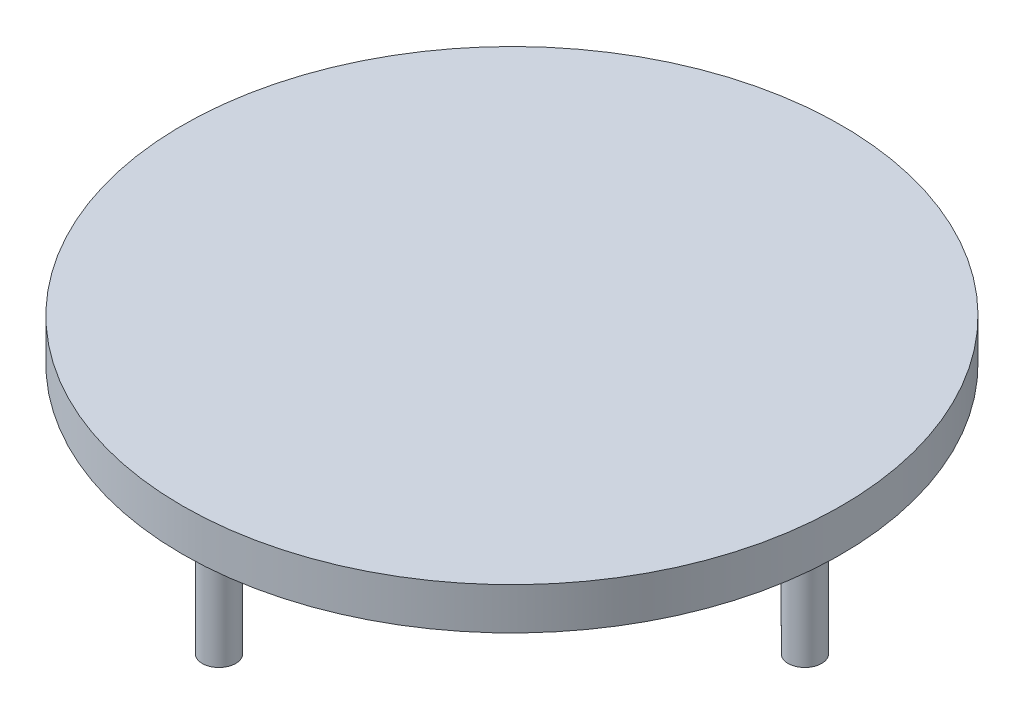
ISO-10303-21;
HEADER;
FILE_DESCRIPTION(('STEP AP214'),'2;1');
FILE_NAME('part.step','',(''),(''),'','','');
FILE_SCHEMA(('AUTOMOTIVE_DESIGN { 1 0 10303 214 1 1 1 1 }'));
ENDSEC;
DATA;
#1=APPLICATION_CONTEXT('core data for automotive mechanical design processes');
#2=APPLICATION_PROTOCOL_DEFINITION('international standard','automotive_design',2000,#1);
#3=PRODUCT_CONTEXT('',#1,'mechanical');
#4=PRODUCT('Part','Part','',(#3));
#5=PRODUCT_RELATED_PRODUCT_CATEGORY('part','',(#4));
#6=PRODUCT_DEFINITION_FORMATION('','',#4);
#7=PRODUCT_DEFINITION_CONTEXT('part definition',#1,'design');
#8=PRODUCT_DEFINITION('design','',#6,#7);
#9=PRODUCT_DEFINITION_SHAPE('','',#8);
#10=(LENGTH_UNIT() NAMED_UNIT(*) SI_UNIT(.MILLI.,.METRE.));
#11=(NAMED_UNIT(*) PLANE_ANGLE_UNIT() SI_UNIT($,.RADIAN.));
#12=(NAMED_UNIT(*) SI_UNIT($,.STERADIAN.) SOLID_ANGLE_UNIT());
#13=UNCERTAINTY_MEASURE_WITH_UNIT(LENGTH_MEASURE(1.E-05),#10,'distance_accuracy_value','');
#14=(GEOMETRIC_REPRESENTATION_CONTEXT(3) GLOBAL_UNCERTAINTY_ASSIGNED_CONTEXT((#13)) GLOBAL_UNIT_ASSIGNED_CONTEXT((#10,
#11,#12)) REPRESENTATION_CONTEXT('',''));
#15=CARTESIAN_POINT('',(0.,0.,0.));
#16=DIRECTION('',(0.,0.,1.));
#17=DIRECTION('',(1.,0.,0.));
#18=AXIS2_PLACEMENT_3D('',#15,#16,#17);
#19=CARTESIAN_POINT('',(0.,2.,0.));
#20=DIRECTION('',(0.,-1.,0.));
#21=DIRECTION('',(0.,0.,-1.));
#22=AXIS2_PLACEMENT_3D('',#19,#20,#21);
#23=CYLINDRICAL_SURFACE('',#22,15.75);
#24=CARTESIAN_POINT('',(0.,2.,0.));
#25=DIRECTION('',(0.,1.,0.));
#26=DIRECTION('',(0.,0.,1.));
#27=AXIS2_PLACEMENT_3D('',#24,#25,#26);
#28=CIRCLE('',#27,15.75);
#29=CARTESIAN_POINT('',(0.,2.,15.75));
#30=VERTEX_POINT('',#29);
#31=EDGE_CURVE('E64',#30,#30,#28,.T.);
#32=ORIENTED_EDGE('',*,*,#31,.F.);
#33=EDGE_LOOP('',(#32));
#34=FACE_BOUND('',#33,.T.);
#35=CARTESIAN_POINT('',(0.,0.,0.));
#36=DIRECTION('',(0.,1.,0.));
#37=DIRECTION('',(0.,0.,1.));
#38=AXIS2_PLACEMENT_3D('',#35,#36,#37);
#39=CIRCLE('',#38,15.75);
#40=CARTESIAN_POINT('',(0.,0.,15.75));
#41=VERTEX_POINT('',#40);
#42=EDGE_CURVE('E65',#41,#41,#39,.T.);
#43=ORIENTED_EDGE('',*,*,#42,.T.);
#44=EDGE_LOOP('',(#43));
#45=FACE_BOUND('',#44,.T.);
#46=ADVANCED_FACE('F41',(#34,#45),#23,.T.);
#47=CARTESIAN_POINT('',(0.,2.,0.));
#48=DIRECTION('',(0.,1.,0.));
#49=DIRECTION('',(0.,0.,1.));
#50=AXIS2_PLACEMENT_3D('',#47,#48,#49);
#51=PLANE('',#50);
#52=ORIENTED_EDGE('',*,*,#31,.T.);
#53=EDGE_LOOP('',(#52));
#54=FACE_BOUND('',#53,.T.);
#55=ADVANCED_FACE('F104',(#54),#51,.T.);
#56=CARTESIAN_POINT('',(0.,0.,0.));
#57=DIRECTION('',(0.,1.,0.));
#58=DIRECTION('',(0.,0.,1.));
#59=AXIS2_PLACEMENT_3D('',#56,#57,#58);
#60=PLANE('',#59);
#61=CARTESIAN_POINT('',(-13.9999999999996,0.,-3.97046679266253E-13));
#62=DIRECTION('',(0.,1.,0.));
#63=DIRECTION('',(0.,0.,1.));
#64=AXIS2_PLACEMENT_3D('',#61,#62,#63);
#65=CIRCLE('',#64,0.800000000000636);
#66=CARTESIAN_POINT('',(-13.9999999999996,0.,0.800000000000238));
#67=VERTEX_POINT('',#66);
#68=EDGE_CURVE('E10',#67,#67,#65,.F.);
#69=ORIENTED_EDGE('',*,*,#68,.F.);
#70=EDGE_LOOP('',(#69));
#71=FACE_BOUND('',#70,.T.);
#72=CARTESIAN_POINT('',(7.90664347494893E-13,0.,-14.));
#73=DIRECTION('',(0.,1.,0.));
#74=DIRECTION('',(0.,0.,1.));
#75=AXIS2_PLACEMENT_3D('',#72,#73,#74);
#76=CIRCLE('',#75,0.80000000000085);
#77=CARTESIAN_POINT('',(7.90664347494893E-13,0.,-13.1999999999992));
#78=VERTEX_POINT('',#77);
#79=EDGE_CURVE('E48',#78,#78,#76,.F.);
#80=ORIENTED_EDGE('',*,*,#79,.F.);
#81=EDGE_LOOP('',(#80));
#82=FACE_BOUND('',#81,.T.);
#83=CARTESIAN_POINT('',(14.0000000000004,0.,3.95332173747447E-13));
#84=DIRECTION('',(0.,1.,0.));
#85=DIRECTION('',(0.,0.,1.));
#86=AXIS2_PLACEMENT_3D('',#83,#84,#85);
#87=CIRCLE('',#86,0.800000000000309);
#88=CARTESIAN_POINT('',(14.0000000000004,0.,0.800000000000704));
#89=VERTEX_POINT('',#88);
#90=EDGE_CURVE('E53',#89,#89,#87,.F.);
#91=ORIENTED_EDGE('',*,*,#90,.F.);
#92=EDGE_LOOP('',(#91));
#93=FACE_BOUND('',#92,.T.);
#94=CARTESIAN_POINT('',(0.,0.,14.));
#95=DIRECTION('',(0.,1.,0.));
#96=DIRECTION('',(0.,0.,1.));
#97=AXIS2_PLACEMENT_3D('',#94,#95,#96);
#98=CIRCLE('',#97,0.8);
#99=CARTESIAN_POINT('',(0.,0.,14.8));
#100=VERTEX_POINT('',#99);
#101=EDGE_CURVE('E58',#100,#100,#98,.F.);
#102=ORIENTED_EDGE('',*,*,#101,.F.);
#103=EDGE_LOOP('',(#102));
#104=FACE_BOUND('',#103,.T.);
#105=ORIENTED_EDGE('',*,*,#42,.F.);
#106=EDGE_LOOP('',(#105));
#107=FACE_BOUND('',#106,.T.);
#108=ADVANCED_FACE('F109',(#71,#82,#93,#104,#107),#60,.F.);
#109=CARTESIAN_POINT('',(0.,-5.,14.));
#110=DIRECTION('',(0.,1.,0.));
#111=DIRECTION('',(0.,0.,1.));
#112=AXIS2_PLACEMENT_3D('',#109,#110,#111);
#113=CYLINDRICAL_SURFACE('',#112,0.8);
#114=CARTESIAN_POINT('',(0.,-5.,14.));
#115=DIRECTION('',(0.,-1.,0.));
#116=DIRECTION('',(0.,0.,-1.));
#117=AXIS2_PLACEMENT_3D('',#114,#115,#116);
#118=CIRCLE('',#117,0.8);
#119=CARTESIAN_POINT('',(0.,-5.,13.2));
#120=VERTEX_POINT('',#119);
#121=EDGE_CURVE('E69',#120,#120,#118,.T.);
#122=ORIENTED_EDGE('',*,*,#121,.F.);
#123=EDGE_LOOP('',(#122));
#124=FACE_BOUND('',#123,.T.);
#125=ORIENTED_EDGE('',*,*,#101,.T.);
#126=EDGE_LOOP('',(#125));
#127=FACE_BOUND('',#126,.T.);
#128=ADVANCED_FACE('F117',(#124,#127),#113,.T.);
#129=CARTESIAN_POINT('',(0.,-5.,14.));
#130=DIRECTION('',(0.,-1.,0.));
#131=DIRECTION('',(0.,0.,-1.));
#132=AXIS2_PLACEMENT_3D('',#129,#130,#131);
#133=PLANE('',#132);
#134=ORIENTED_EDGE('',*,*,#121,.T.);
#135=EDGE_LOOP('',(#134));
#136=FACE_BOUND('',#135,.T.);
#137=ADVANCED_FACE('F122',(#136),#133,.T.);
#138=CARTESIAN_POINT('',(14.0000000000004,-5.,3.95332173747447E-13));
#139=DIRECTION('',(0.,1.,0.));
#140=DIRECTION('',(0.,0.,1.));
#141=AXIS2_PLACEMENT_3D('',#138,#139,#140);
#142=CYLINDRICAL_SURFACE('',#141,0.800000000000309);
#143=CARTESIAN_POINT('',(14.0000000000004,-5.,3.95332173747447E-13));
#144=DIRECTION('',(0.,-1.,0.));
#145=DIRECTION('',(0.,0.,-1.));
#146=AXIS2_PLACEMENT_3D('',#143,#144,#145);
#147=CIRCLE('',#146,0.800000000000309);
#148=CARTESIAN_POINT('',(14.0000000000004,-5.,-0.799999999999914));
#149=VERTEX_POINT('',#148);
#150=EDGE_CURVE('E76',#149,#149,#147,.T.);
#151=ORIENTED_EDGE('',*,*,#150,.F.);
#152=EDGE_LOOP('',(#151));
#153=FACE_BOUND('',#152,.T.);
#154=ORIENTED_EDGE('',*,*,#90,.T.);
#155=EDGE_LOOP('',(#154));
#156=FACE_BOUND('',#155,.T.);
#157=ADVANCED_FACE('F129',(#153,#156),#142,.T.);
#158=CARTESIAN_POINT('',(14.0000000000004,-5.,3.95332173747447E-13));
#159=DIRECTION('',(0.,-1.,0.));
#160=DIRECTION('',(0.,0.,-1.));
#161=AXIS2_PLACEMENT_3D('',#158,#159,#160);
#162=PLANE('',#161);
#163=ORIENTED_EDGE('',*,*,#150,.T.);
#164=EDGE_LOOP('',(#163));
#165=FACE_BOUND('',#164,.T.);
#166=ADVANCED_FACE('F131',(#165),#162,.T.);
#167=CARTESIAN_POINT('',(7.90664347494893E-13,-5.,-14.));
#168=DIRECTION('',(0.,1.,0.));
#169=DIRECTION('',(0.,0.,1.));
#170=AXIS2_PLACEMENT_3D('',#167,#168,#169);
#171=CYLINDRICAL_SURFACE('',#170,0.80000000000085);
#172=CARTESIAN_POINT('',(7.90664347494893E-13,-5.,-14.));
#173=DIRECTION('',(0.,-1.,0.));
#174=DIRECTION('',(0.,0.,-1.));
#175=AXIS2_PLACEMENT_3D('',#172,#173,#174);
#176=CIRCLE('',#175,0.80000000000085);
#177=CARTESIAN_POINT('',(7.90664347494893E-13,-5.,-14.8000000000008));
#178=VERTEX_POINT('',#177);
#179=EDGE_CURVE('E80',#178,#178,#176,.T.);
#180=ORIENTED_EDGE('',*,*,#179,.F.);
#181=EDGE_LOOP('',(#180));
#182=FACE_BOUND('',#181,.T.);
#183=ORIENTED_EDGE('',*,*,#79,.T.);
#184=EDGE_LOOP('',(#183));
#185=FACE_BOUND('',#184,.T.);
#186=ADVANCED_FACE('F100',(#182,#185),#171,.T.);
#187=CARTESIAN_POINT('',(7.90664347494893E-13,-5.,-14.));
#188=DIRECTION('',(0.,-1.,0.));
#189=DIRECTION('',(0.,0.,-1.));
#190=AXIS2_PLACEMENT_3D('',#187,#188,#189);
#191=PLANE('',#190);
#192=ORIENTED_EDGE('',*,*,#179,.T.);
#193=EDGE_LOOP('',(#192));
#194=FACE_BOUND('',#193,.T.);
#195=ADVANCED_FACE('F93',(#194),#191,.T.);
#196=CARTESIAN_POINT('',(-13.9999999999996,-5.,-3.97046679266253E-13));
#197=DIRECTION('',(0.,1.,0.));
#198=DIRECTION('',(0.,0.,1.));
#199=AXIS2_PLACEMENT_3D('',#196,#197,#198);
#200=CYLINDRICAL_SURFACE('',#199,0.800000000000636);
#201=CARTESIAN_POINT('',(-13.9999999999996,-5.,-3.97046679266253E-13));
#202=DIRECTION('',(0.,-1.,0.));
#203=DIRECTION('',(0.,0.,-1.));
#204=AXIS2_PLACEMENT_3D('',#201,#202,#203);
#205=CIRCLE('',#204,0.800000000000636);
#206=CARTESIAN_POINT('',(-13.9999999999996,-5.,-0.800000000001033));
#207=VERTEX_POINT('',#206);
#208=EDGE_CURVE('E84',#207,#207,#205,.T.);
#209=ORIENTED_EDGE('',*,*,#208,.F.);
#210=EDGE_LOOP('',(#209));
#211=FACE_BOUND('',#210,.T.);
#212=ORIENTED_EDGE('',*,*,#68,.T.);
#213=EDGE_LOOP('',(#212));
#214=FACE_BOUND('',#213,.T.);
#215=ADVANCED_FACE('F91',(#211,#214),#200,.T.);
#216=CARTESIAN_POINT('',(-13.9999999999996,-5.,-3.97046679266253E-13));
#217=DIRECTION('',(0.,-1.,0.));
#218=DIRECTION('',(0.,0.,-1.));
#219=AXIS2_PLACEMENT_3D('',#216,#217,#218);
#220=PLANE('',#219);
#221=ORIENTED_EDGE('',*,*,#208,.T.);
#222=EDGE_LOOP('',(#221));
#223=FACE_BOUND('',#222,.T.);
#224=ADVANCED_FACE('F89',(#223),#220,.T.);
#225=CLOSED_SHELL('',(#46,#55,#108,#128,#137,#157,#166,#186,#195,#215,#224));
#226=MANIFOLD_SOLID_BREP('B2',#225);
#227=ADVANCED_BREP_SHAPE_REPRESENTATION('',(#18,#226),#14);
#228=SHAPE_DEFINITION_REPRESENTATION(#9,#227);
ENDSEC;
END-ISO-10303-21;
